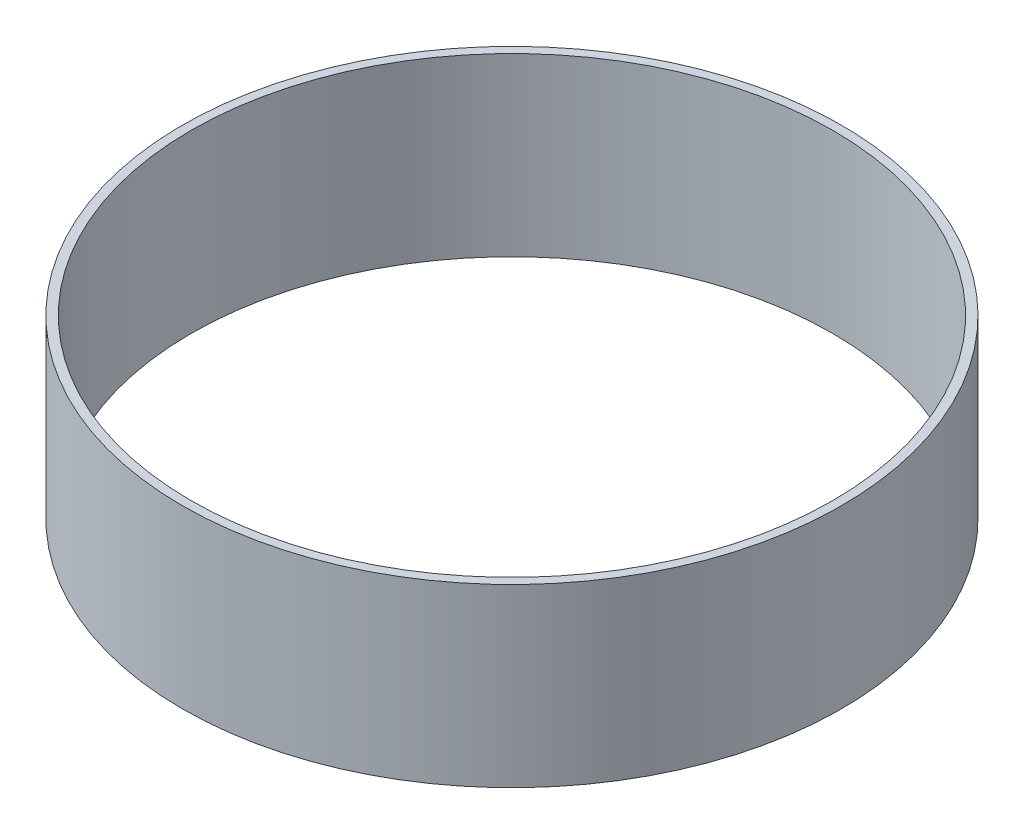
ISO-10303-21;
HEADER;
FILE_DESCRIPTION(('STEP AP214'),'2;1');
FILE_NAME('part.step','',(''),(''),'','','');
FILE_SCHEMA(('AUTOMOTIVE_DESIGN { 1 0 10303 214 1 1 1 1 }'));
ENDSEC;
DATA;
#1=APPLICATION_CONTEXT('core data for automotive mechanical design processes');
#2=APPLICATION_PROTOCOL_DEFINITION('international standard','automotive_design',2000,#1);
#3=PRODUCT_CONTEXT('',#1,'mechanical');
#4=PRODUCT('Part','Part','',(#3));
#5=PRODUCT_RELATED_PRODUCT_CATEGORY('part','',(#4));
#6=PRODUCT_DEFINITION_FORMATION('','',#4);
#7=PRODUCT_DEFINITION_CONTEXT('part definition',#1,'design');
#8=PRODUCT_DEFINITION('design','',#6,#7);
#9=PRODUCT_DEFINITION_SHAPE('','',#8);
#10=(LENGTH_UNIT() NAMED_UNIT(*) SI_UNIT(.MILLI.,.METRE.));
#11=(NAMED_UNIT(*) PLANE_ANGLE_UNIT() SI_UNIT($,.RADIAN.));
#12=(NAMED_UNIT(*) SI_UNIT($,.STERADIAN.) SOLID_ANGLE_UNIT());
#13=UNCERTAINTY_MEASURE_WITH_UNIT(LENGTH_MEASURE(1.E-05),#10,'distance_accuracy_value','');
#14=(GEOMETRIC_REPRESENTATION_CONTEXT(3) GLOBAL_UNCERTAINTY_ASSIGNED_CONTEXT((#13)) GLOBAL_UNIT_ASSIGNED_CONTEXT((#10,
#11,#12)) REPRESENTATION_CONTEXT('',''));
#15=CARTESIAN_POINT('',(0.,0.,0.));
#16=DIRECTION('',(0.,0.,1.));
#17=DIRECTION('',(1.,0.,0.));
#18=AXIS2_PLACEMENT_3D('',#15,#16,#17);
#19=CARTESIAN_POINT('',(138.90625,192.951652173913,0.));
#20=DIRECTION('',(0.,1.,0.));
#21=DIRECTION('',(0.,0.,1.));
#22=AXIS2_PLACEMENT_3D('',#19,#20,#21);
#23=PLANE('',#22);
#24=CARTESIAN_POINT('',(0.,192.951652173913,0.));
#25=DIRECTION('',(0.,1.,0.));
#26=DIRECTION('',(0.,0.,1.));
#27=AXIS2_PLACEMENT_3D('',#24,#25,#26);
#28=CIRCLE('',#27,142.71625);
#29=CARTESIAN_POINT('',(0.,192.951652173913,142.71625));
#30=VERTEX_POINT('',#29);
#31=EDGE_CURVE('E10',#30,#30,#28,.T.);
#32=ORIENTED_EDGE('',*,*,#31,.T.);
#33=EDGE_LOOP('',(#32));
#34=FACE_BOUND('',#33,.T.);
#35=CARTESIAN_POINT('',(0.,192.951652173913,0.));
#36=DIRECTION('',(0.,1.,0.));
#37=DIRECTION('',(0.,0.,1.));
#38=AXIS2_PLACEMENT_3D('',#35,#36,#37);
#39=CIRCLE('',#38,138.90625);
#40=CARTESIAN_POINT('',(0.,192.951652173913,138.90625));
#41=VERTEX_POINT('',#40);
#42=EDGE_CURVE('E56',#41,#41,#39,.T.);
#43=ORIENTED_EDGE('',*,*,#42,.F.);
#44=EDGE_LOOP('',(#43));
#45=FACE_BOUND('',#44,.T.);
#46=ADVANCED_FACE('F39',(#34,#45),#23,.T.);
#47=CARTESIAN_POINT('',(0.,0.,0.));
#48=DIRECTION('',(0.,1.,0.));
#49=DIRECTION('',(0.,0.,1.));
#50=AXIS2_PLACEMENT_3D('',#47,#48,#49);
#51=CYLINDRICAL_SURFACE('',#50,142.71625);
#52=CARTESIAN_POINT('',(0.,116.751652173913,0.));
#53=DIRECTION('',(0.,1.,0.));
#54=DIRECTION('',(0.,0.,1.));
#55=AXIS2_PLACEMENT_3D('',#52,#53,#54);
#56=CIRCLE('',#55,142.71625);
#57=CARTESIAN_POINT('',(0.,116.751652173913,142.71625));
#58=VERTEX_POINT('',#57);
#59=EDGE_CURVE('E46',#58,#58,#56,.T.);
#60=ORIENTED_EDGE('',*,*,#59,.T.);
#61=EDGE_LOOP('',(#60));
#62=FACE_BOUND('',#61,.T.);
#63=ORIENTED_EDGE('',*,*,#31,.F.);
#64=EDGE_LOOP('',(#63));
#65=FACE_BOUND('',#64,.T.);
#66=ADVANCED_FACE('F66',(#62,#65),#51,.T.);
#67=CARTESIAN_POINT('',(138.90625,116.751652173913,0.));
#68=DIRECTION('',(0.,1.,0.));
#69=DIRECTION('',(0.,0.,1.));
#70=AXIS2_PLACEMENT_3D('',#67,#68,#69);
#71=PLANE('',#70);
#72=ORIENTED_EDGE('',*,*,#59,.F.);
#73=EDGE_LOOP('',(#72));
#74=FACE_BOUND('',#73,.T.);
#75=CARTESIAN_POINT('',(0.,116.751652173913,0.));
#76=DIRECTION('',(0.,1.,0.));
#77=DIRECTION('',(0.,0.,1.));
#78=AXIS2_PLACEMENT_3D('',#75,#76,#77);
#79=CIRCLE('',#78,138.90625);
#80=CARTESIAN_POINT('',(0.,116.751652173913,138.90625));
#81=VERTEX_POINT('',#80);
#82=EDGE_CURVE('E51',#81,#81,#79,.T.);
#83=ORIENTED_EDGE('',*,*,#82,.T.);
#84=EDGE_LOOP('',(#83));
#85=FACE_BOUND('',#84,.T.);
#86=ADVANCED_FACE('F70',(#74,#85),#71,.F.);
#87=CARTESIAN_POINT('',(0.,0.,0.));
#88=DIRECTION('',(0.,1.,0.));
#89=DIRECTION('',(0.,0.,1.));
#90=AXIS2_PLACEMENT_3D('',#87,#88,#89);
#91=CYLINDRICAL_SURFACE('',#90,138.90625);
#92=ORIENTED_EDGE('',*,*,#82,.F.);
#93=EDGE_LOOP('',(#92));
#94=FACE_BOUND('',#93,.T.);
#95=ORIENTED_EDGE('',*,*,#42,.T.);
#96=EDGE_LOOP('',(#95));
#97=FACE_BOUND('',#96,.T.);
#98=ADVANCED_FACE('F63',(#94,#97),#91,.F.);
#99=CLOSED_SHELL('',(#46,#66,#86,#98));
#100=MANIFOLD_SOLID_BREP('B2',#99);
#101=ADVANCED_BREP_SHAPE_REPRESENTATION('',(#18,#100),#14);
#102=SHAPE_DEFINITION_REPRESENTATION(#9,#101);
ENDSEC;
END-ISO-10303-21;
